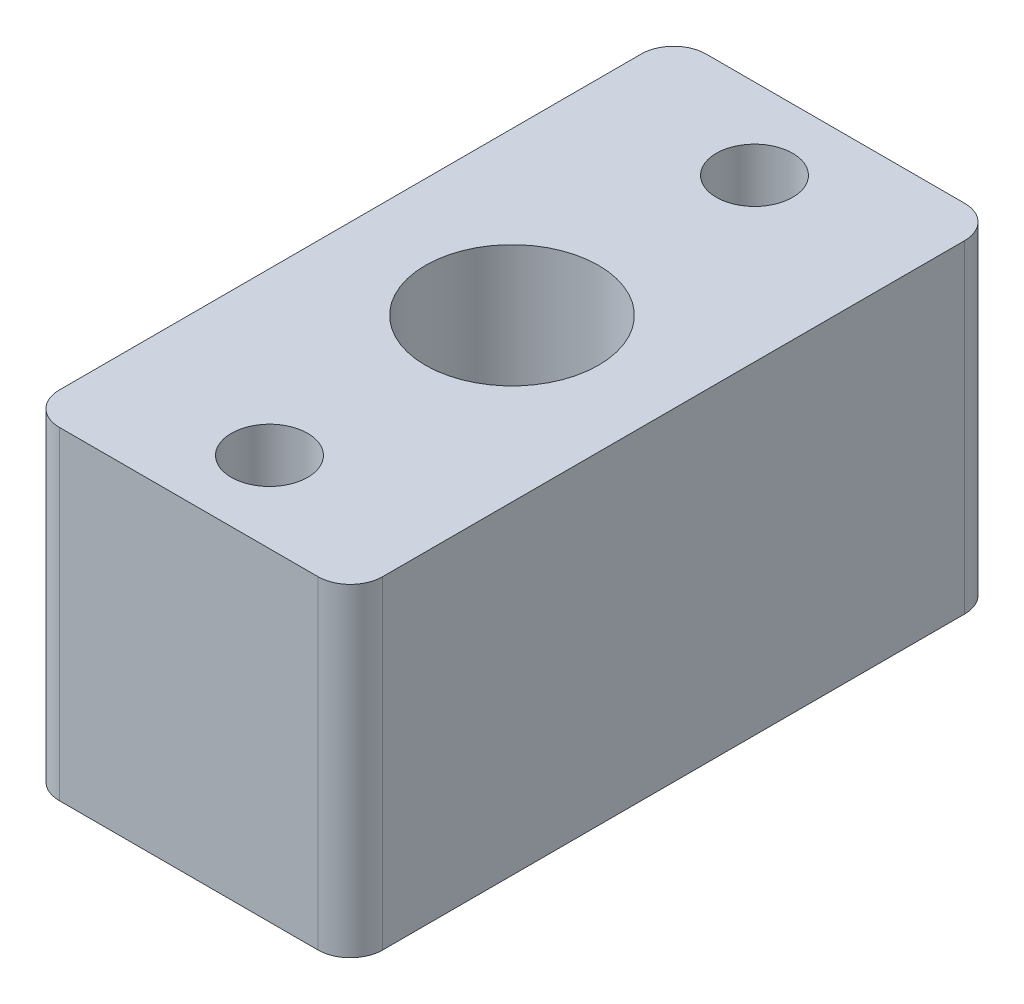
ISO-10303-21;
HEADER;
FILE_DESCRIPTION(('STEP AP214'),'2;1');
FILE_NAME('part.step','',(''),(''),'','','');
FILE_SCHEMA(('AUTOMOTIVE_DESIGN { 1 0 10303 214 1 1 1 1 }'));
ENDSEC;
DATA;
#1=APPLICATION_CONTEXT('core data for automotive mechanical design processes');
#2=APPLICATION_PROTOCOL_DEFINITION('international standard','automotive_design',2000,#1);
#3=PRODUCT_CONTEXT('',#1,'mechanical');
#4=PRODUCT('Part','Part','',(#3));
#5=PRODUCT_RELATED_PRODUCT_CATEGORY('part','',(#4));
#6=PRODUCT_DEFINITION_FORMATION('','',#4);
#7=PRODUCT_DEFINITION_CONTEXT('part definition',#1,'design');
#8=PRODUCT_DEFINITION('design','',#6,#7);
#9=PRODUCT_DEFINITION_SHAPE('','',#8);
#10=(LENGTH_UNIT() NAMED_UNIT(*) SI_UNIT(.MILLI.,.METRE.));
#11=(NAMED_UNIT(*) PLANE_ANGLE_UNIT() SI_UNIT($,.RADIAN.));
#12=(NAMED_UNIT(*) SI_UNIT($,.STERADIAN.) SOLID_ANGLE_UNIT());
#13=UNCERTAINTY_MEASURE_WITH_UNIT(LENGTH_MEASURE(1.E-05),#10,'distance_accuracy_value','');
#14=(GEOMETRIC_REPRESENTATION_CONTEXT(3) GLOBAL_UNCERTAINTY_ASSIGNED_CONTEXT((#13)) GLOBAL_UNIT_ASSIGNED_CONTEXT((#10,
#11,#12)) REPRESENTATION_CONTEXT('',''));
#15=CARTESIAN_POINT('',(0.,0.,0.));
#16=DIRECTION('',(0.,0.,1.));
#17=DIRECTION('',(1.,0.,0.));
#18=AXIS2_PLACEMENT_3D('',#15,#16,#17);
#19=CARTESIAN_POINT('',(9.95917099578882,-18011.187363794,-483.287251614497));
#20=DIRECTION('',(0.999999999042625,4.15567144702978E-05,-1.37036123745127E-05));
#21=DIRECTION('',(-4.15567144741997E-05,0.99999999913652,0.));
#22=AXIS2_PLACEMENT_3D('',#19,#20,#21);
#23=PLANE('',#22);
#24=DIRECTION('',(-1.37041015944916E-05,1.17720830808695E-05,-0.999999999836808));
#25=VECTOR('',#24,1.);
#26=CARTESIAN_POINT('',(9.95917099578882,-18011.187363794,-483.287251614497));
#27=LINE('',#26,#25);
#28=CARTESIAN_POINT('',(9.95915359157979,-18011.1873488434,-484.55725161429));
#29=VERTEX_POINT('',#28);
#30=CARTESIAN_POINT('',(9.95884031581734,-18011.1870797336,-507.417251610559));
#31=VERTEX_POINT('',#30);
#32=EDGE_CURVE('E132',#29,#31,#27,.T.);
#33=ORIENTED_EDGE('',*,*,#32,.T.);
#34=DIRECTION('',(-4.1556553143453E-05,0.999999999067229,1.17726525394311E-05));
#35=VECTOR('',#34,1.);
#36=CARTESIAN_POINT('',(9.95884031581734,-18011.1870797336,-507.417251610559));
#37=LINE('',#36,#35);
#38=CARTESIAN_POINT('',(9.95831254759242,-17998.4870797454,-507.417102097872));
#39=VERTEX_POINT('',#38);
#40=EDGE_CURVE('E11',#31,#39,#37,.T.);
#41=ORIENTED_EDGE('',*,*,#40,.T.);
#42=DIRECTION('',(-1.37041015944916E-05,1.17720830808695E-05,-0.999999999836808));
#43=VECTOR('',#42,1.);
#44=CARTESIAN_POINT('',(9.9586432275639,-17998.4873638058,-483.28710210181));
#45=LINE('',#44,#43);
#46=CARTESIAN_POINT('',(9.95862582335487,-17998.4873488553,-484.557102101603));
#47=VERTEX_POINT('',#46);
#48=EDGE_CURVE('E134',#47,#39,#45,.T.);
#49=ORIENTED_EDGE('',*,*,#48,.F.);
#50=DIRECTION('',(-4.1556553143453E-05,0.999999999067229,1.17726525394311E-05));
#51=VECTOR('',#50,1.);
#52=CARTESIAN_POINT('',(9.95915359157979,-18011.1873488434,-484.55725161429));
#53=LINE('',#52,#51);
#54=EDGE_CURVE('E45',#47,#29,#53,.F.);
#55=ORIENTED_EDGE('',*,*,#54,.T.);
#56=EDGE_LOOP('',(#33,#41,#49,#55));
#57=FACE_BOUND('',#56,.T.);
#58=ADVANCED_FACE('F37',(#57),#23,.T.);
#59=CARTESIAN_POINT('',(9.95917099578882,-18011.187363794,-483.287251614497));
#60=DIRECTION('',(-1.37041015943094E-05,1.17720830532643E-05,-0.999999999836808));
#61=DIRECTION('',(-0.999999999906099,0.,1.3704101595259E-05));
#62=AXIS2_PLACEMENT_3D('',#59,#60,#61);
#63=PLANE('',#62);
#64=DIRECTION('',(-0.999999999042625,-4.15567143251763E-05,1.37036123743333E-05));
#65=VECTOR('',#64,1.);
#66=CARTESIAN_POINT('',(9.9586432275639,-17998.4873638058,-483.28710210181));
#67=LINE('',#66,#65);
#68=CARTESIAN_POINT('',(8.68864322877976,-17998.4874165828,-483.287084698222));
#69=VERTEX_POINT('',#68);
#70=CARTESIAN_POINT('',(-1.47135676149331,-17998.4878387991,-483.286945469521));
#71=VERTEX_POINT('',#70);
#72=EDGE_CURVE('E129',#69,#71,#67,.T.);
#73=ORIENTED_EDGE('',*,*,#72,.T.);
#74=DIRECTION('',(-4.1556553143453E-05,0.999999999067229,1.17726525394311E-05));
#75=VECTOR('',#74,1.);
#76=CARTESIAN_POINT('',(-1.47082899326839,-18011.1878387872,-483.287094982208));
#77=LINE('',#76,#75);
#78=CARTESIAN_POINT('',(-1.47082899326839,-18011.1878387872,-483.287094982208));
#79=VERTEX_POINT('',#78);
#80=EDGE_CURVE('E109',#71,#79,#77,.F.);
#81=ORIENTED_EDGE('',*,*,#80,.T.);
#82=DIRECTION('',(-0.999999999042625,-4.15567143251763E-05,1.37036123743333E-05));
#83=VECTOR('',#82,1.);
#84=CARTESIAN_POINT('',(9.95917099578882,-18011.187363794,-483.287251614497));
#85=LINE('',#84,#83);
#86=CARTESIAN_POINT('',(8.68917099700469,-18011.187416571,-483.28723421091));
#87=VERTEX_POINT('',#86);
#88=EDGE_CURVE('E138',#87,#79,#85,.T.);
#89=ORIENTED_EDGE('',*,*,#88,.F.);
#90=DIRECTION('',(-4.1556553143453E-05,0.999999999067229,1.17726525394311E-05));
#91=VECTOR('',#90,1.);
#92=CARTESIAN_POINT('',(8.68864322877976,-17998.4874165828,-483.287084698222));
#93=LINE('',#92,#91);
#94=EDGE_CURVE('E114',#87,#69,#93,.T.);
#95=ORIENTED_EDGE('',*,*,#94,.T.);
#96=EDGE_LOOP('',(#73,#81,#89,#95));
#97=FACE_BOUND('',#96,.T.);
#98=ADVANCED_FACE('F174',(#97),#63,.F.);
#99=CARTESIAN_POINT('',(-2.74082899205252,-18011.1878915642,-483.28707757862));
#100=DIRECTION('',(0.999999999042625,4.15567144702978E-05,-1.37036123744102E-05));
#101=DIRECTION('',(-4.15567144741997E-05,0.99999999913652,0.));
#102=AXIS2_PLACEMENT_3D('',#99,#100,#101);
#103=PLANE('',#102);
#104=DIRECTION('',(-1.37041015943892E-05,1.17720830808695E-05,-0.999999999836808));
#105=VECTOR('',#104,1.);
#106=CARTESIAN_POINT('',(-2.74082899205252,-18011.1878915642,-483.28707757862));
#107=LINE('',#106,#105);
#108=CARTESIAN_POINT('',(-2.74084639626155,-18011.1878766137,-484.557077578413));
#109=VERTEX_POINT('',#108);
#110=CARTESIAN_POINT('',(-2.74115967202399,-18011.1876075039,-507.417077574682));
#111=VERTEX_POINT('',#110);
#112=EDGE_CURVE('E123',#109,#111,#107,.T.);
#113=ORIENTED_EDGE('',*,*,#112,.F.);
#114=DIRECTION('',(-4.1556553143453E-05,0.999999999067229,1.17726525394311E-05));
#115=VECTOR('',#114,1.);
#116=CARTESIAN_POINT('',(-2.74084639626155,-18011.1878766137,-484.557077578413));
#117=LINE('',#116,#115);
#118=CARTESIAN_POINT('',(-2.74137416448647,-17998.4878766255,-484.556928065726));
#119=VERTEX_POINT('',#118);
#120=EDGE_CURVE('E108',#109,#119,#117,.T.);
#121=ORIENTED_EDGE('',*,*,#120,.T.);
#122=DIRECTION('',(-1.37041015943892E-05,1.17720830808695E-05,-0.999999999836808));
#123=VECTOR('',#122,1.);
#124=CARTESIAN_POINT('',(-2.74135676027744,-17998.4878915761,-483.286928065933));
#125=LINE('',#124,#123);
#126=CARTESIAN_POINT('',(-2.74168744024891,-17998.4876075157,-507.416928061995));
#127=VERTEX_POINT('',#126);
#128=EDGE_CURVE('E121',#119,#127,#125,.T.);
#129=ORIENTED_EDGE('',*,*,#128,.T.);
#130=DIRECTION('',(-4.1556553143453E-05,0.999999999067229,1.17726525394311E-05));
#131=VECTOR('',#130,1.);
#132=CARTESIAN_POINT('',(-2.74115967202399,-18011.1876075039,-507.417077574682));
#133=LINE('',#132,#131);
#134=EDGE_CURVE('E125',#127,#111,#133,.F.);
#135=ORIENTED_EDGE('',*,*,#134,.T.);
#136=EDGE_LOOP('',(#113,#121,#129,#135));
#137=FACE_BOUND('',#136,.T.);
#138=ADVANCED_FACE('F120',(#137),#103,.F.);
#139=CARTESIAN_POINT('',(9.95882291160832,-18011.1870647831,-508.687251610352));
#140=DIRECTION('',(-1.37041015943094E-05,1.17720830532643E-05,-0.999999999836808));
#141=DIRECTION('',(-0.999999999906099,0.,1.3704101595259E-05));
#142=AXIS2_PLACEMENT_3D('',#139,#140,#141);
#143=PLANE('',#142);
#144=DIRECTION('',(-0.999999999042625,-4.15567143251764E-05,1.37036123743333E-05));
#145=VECTOR('',#144,1.);
#146=CARTESIAN_POINT('',(9.95882291160832,-18011.1870647831,-508.687251610352));
#147=LINE('',#146,#145);
#148=CARTESIAN_POINT('',(8.68882291282418,-18011.1871175601,-508.687234206764));
#149=VERTEX_POINT('',#148);
#150=CARTESIAN_POINT('',(-1.47117707744888,-18011.1875397763,-508.687094978063));
#151=VERTEX_POINT('',#150);
#152=EDGE_CURVE('E170',#149,#151,#147,.T.);
#153=ORIENTED_EDGE('',*,*,#152,.T.);
#154=DIRECTION('',(-4.1556553143453E-05,0.999999999067229,1.17726525394311E-05));
#155=VECTOR('',#154,1.);
#156=CARTESIAN_POINT('',(-1.47170484567381,-17998.4875397881,-508.686945465375));
#157=LINE('',#156,#155);
#158=CARTESIAN_POINT('',(-1.47170484567381,-17998.4875397881,-508.686945465375));
#159=VERTEX_POINT('',#158);
#160=EDGE_CURVE('E155',#151,#159,#157,.T.);
#161=ORIENTED_EDGE('',*,*,#160,.T.);
#162=DIRECTION('',(-0.999999999042625,-4.15567143251764E-05,1.37036123743333E-05));
#163=VECTOR('',#162,1.);
#164=CARTESIAN_POINT('',(9.9582951433834,-17998.4870647949,-508.687102097665));
#165=LINE('',#164,#163);
#166=CARTESIAN_POINT('',(8.68829514459926,-17998.4871175719,-508.687084694077));
#167=VERTEX_POINT('',#166);
#168=EDGE_CURVE('E130',#167,#159,#165,.T.);
#169=ORIENTED_EDGE('',*,*,#168,.F.);
#170=DIRECTION('',(-4.1556553143453E-05,0.999999999067229,1.17726525394311E-05));
#171=VECTOR('',#170,1.);
#172=CARTESIAN_POINT('',(8.68882291282418,-18011.1871175601,-508.687234206764));
#173=LINE('',#172,#171);
#174=EDGE_CURVE('E59',#167,#149,#173,.F.);
#175=ORIENTED_EDGE('',*,*,#174,.T.);
#176=EDGE_LOOP('',(#153,#161,#169,#175));
#177=FACE_BOUND('',#176,.T.);
#178=ADVANCED_FACE('F216',(#177),#143,.T.);
#179=CARTESIAN_POINT('',(0.748483115188057,-18011.1934336351,-0.212039522809267));
#180=DIRECTION('',(-4.15565529983312E-05,0.999999999067229,1.17726525670342E-05));
#181=DIRECTION('',(-0.999999999136527,-4.1556553001211E-05,0.));
#182=AXIS2_PLACEMENT_3D('',#179,#180,#181);
#183=PLANE('',#182);
#184=CARTESIAN_POINT('',(3.60912749134374,-18011.1875903027,-486.462164596041));
#185=DIRECTION('',(-4.15565529983312E-05,0.999999999067229,1.17726525670342E-05));
#186=DIRECTION('',(-0.999999999136527,-4.1556553001211E-05,0.));
#187=AXIS2_PLACEMENT_3D('',#184,#185,#186);
#188=CIRCLE('',#187,1.5);
#189=CARTESIAN_POINT('',(2.10912749263896,-18011.1876526376,-486.462164596041));
#190=VERTEX_POINT('',#189);
#191=EDGE_CURVE('E191',#190,#190,#188,.T.);
#192=ORIENTED_EDGE('',*,*,#191,.T.);
#193=EDGE_LOOP('',(#192));
#194=FACE_BOUND('',#193,.T.);
#195=CARTESIAN_POINT('',(3.60886642820837,-18011.1873660446,-505.512164592932));
#196=DIRECTION('',(-4.15565529983312E-05,0.999999999067229,1.17726525670342E-05));
#197=DIRECTION('',(-0.999999999136527,-4.1556553001211E-05,0.));
#198=AXIS2_PLACEMENT_3D('',#195,#196,#197);
#199=CIRCLE('',#198,1.5);
#200=CARTESIAN_POINT('',(2.10886642950358,-18011.1874283794,-505.512164592932));
#201=VERTEX_POINT('',#200);
#202=EDGE_CURVE('E185',#201,#201,#199,.T.);
#203=ORIENTED_EDGE('',*,*,#202,.T.);
#204=EDGE_LOOP('',(#203));
#205=FACE_BOUND('',#204,.T.);
#206=CARTESIAN_POINT('',(3.60899695977606,-18011.1874781737,-495.987164594487));
#207=DIRECTION('',(-4.15565529983312E-05,0.999999999067229,1.17726525670342E-05));
#208=DIRECTION('',(-0.999999999136527,-4.1556553001211E-05,0.));
#209=AXIS2_PLACEMENT_3D('',#206,#207,#208);
#210=CIRCLE('',#209,3.4);
#211=CARTESIAN_POINT('',(0.20899696271187,-18011.1876194659,-495.987164594487));
#212=VERTEX_POINT('',#211);
#213=EDGE_CURVE('E175',#212,#212,#210,.T.);
#214=ORIENTED_EDGE('',*,*,#213,.T.);
#215=EDGE_LOOP('',(#214));
#216=FACE_BOUND('',#215,.T.);
#217=ORIENTED_EDGE('',*,*,#88,.T.);
#218=CARTESIAN_POINT('',(-1.47084639747741,-18011.1878238367,-484.557094982001));
#219=DIRECTION('',(-4.15565529983312E-05,0.999999999067229,1.17726525670342E-05));
#220=DIRECTION('',(-0.999999999136527,-4.1556553001211E-05,0.));
#221=AXIS2_PLACEMENT_3D('',#218,#219,#220);
#222=CIRCLE('',#221,1.27);
#223=EDGE_CURVE('E152',#79,#109,#222,.F.);
#224=ORIENTED_EDGE('',*,*,#223,.T.);
#225=ORIENTED_EDGE('',*,*,#112,.T.);
#226=CARTESIAN_POINT('',(-1.47115967323986,-18011.1875547269,-507.41709497827));
#227=DIRECTION('',(-4.15565529983312E-05,0.999999999067229,1.17726525670342E-05));
#228=DIRECTION('',(-0.999999999136527,-4.1556553001211E-05,0.));
#229=AXIS2_PLACEMENT_3D('',#226,#227,#228);
#230=CIRCLE('',#229,1.27);
#231=EDGE_CURVE('E52',#111,#151,#230,.F.);
#232=ORIENTED_EDGE('',*,*,#231,.T.);
#233=ORIENTED_EDGE('',*,*,#152,.F.);
#234=CARTESIAN_POINT('',(8.68884031703321,-18011.1871325106,-507.417234206972));
#235=DIRECTION('',(-4.15565529983312E-05,0.999999999067229,1.17726525670342E-05));
#236=DIRECTION('',(-0.999999999136527,-4.1556553001211E-05,0.));
#237=AXIS2_PLACEMENT_3D('',#234,#235,#236);
#238=CIRCLE('',#237,1.27);
#239=EDGE_CURVE('E149',#149,#31,#238,.F.);
#240=ORIENTED_EDGE('',*,*,#239,.T.);
#241=ORIENTED_EDGE('',*,*,#32,.F.);
#242=CARTESIAN_POINT('',(8.68915359279566,-18011.1874016205,-484.557234210702));
#243=DIRECTION('',(-4.15565529983312E-05,0.999999999067229,1.17726525670342E-05));
#244=DIRECTION('',(-0.999999999136527,-4.1556553001211E-05,0.));
#245=AXIS2_PLACEMENT_3D('',#242,#243,#244);
#246=CIRCLE('',#245,1.27);
#247=EDGE_CURVE('E147',#29,#87,#246,.F.);
#248=ORIENTED_EDGE('',*,*,#247,.T.);
#249=EDGE_LOOP('',(#217,#224,#225,#232,#233,#240,#241,#248));
#250=FACE_BOUND('',#249,.T.);
#251=ADVANCED_FACE('F167',(#194,#205,#216,#250),#183,.F.);
#252=CARTESIAN_POINT('',(0.747955346963135,-17998.4934336469,-0.211890010122016));
#253=DIRECTION('',(-4.15565529983312E-05,0.999999999067229,1.17726525670342E-05));
#254=DIRECTION('',(-0.999999999136527,-4.1556553001211E-05,0.));
#255=AXIS2_PLACEMENT_3D('',#252,#253,#254);
#256=PLANE('',#255);
#257=CARTESIAN_POINT('',(3.60859972312067,-17998.4875903146,-486.462015083353));
#258=DIRECTION('',(-4.15565529983313E-05,0.999999999067229,1.17726525670342E-05));
#259=DIRECTION('',(-0.999999999136526,-4.1556553001211E-05,0.));
#260=AXIS2_PLACEMENT_3D('',#257,#258,#259);
#261=CIRCLE('',#260,1.5);
#262=CARTESIAN_POINT('',(2.10859972441588,-17998.4876526494,-486.462015083353));
#263=VERTEX_POINT('',#262);
#264=EDGE_CURVE('E194',#263,#263,#261,.T.);
#265=ORIENTED_EDGE('',*,*,#264,.F.);
#266=EDGE_LOOP('',(#265));
#267=FACE_BOUND('',#266,.T.);
#268=CARTESIAN_POINT('',(3.60833865998529,-17998.4873660564,-505.512015080244));
#269=DIRECTION('',(-4.15565529983313E-05,0.999999999067229,1.17726525670342E-05));
#270=DIRECTION('',(-0.999999999136526,-4.1556553001211E-05,0.));
#271=AXIS2_PLACEMENT_3D('',#268,#269,#270);
#272=CIRCLE('',#271,1.5);
#273=CARTESIAN_POINT('',(2.10833866128051,-17998.4874283913,-505.512015080244));
#274=VERTEX_POINT('',#273);
#275=EDGE_CURVE('E188',#274,#274,#272,.T.);
#276=ORIENTED_EDGE('',*,*,#275,.F.);
#277=EDGE_LOOP('',(#276));
#278=FACE_BOUND('',#277,.T.);
#279=CARTESIAN_POINT('',(3.60846919155298,-17998.4874781855,-495.987015081799));
#280=DIRECTION('',(-4.15565529983313E-05,0.999999999067229,1.17726525670342E-05));
#281=DIRECTION('',(-0.999999999136526,-4.1556553001211E-05,0.));
#282=AXIS2_PLACEMENT_3D('',#279,#280,#281);
#283=CIRCLE('',#282,3.39999999999998);
#284=CARTESIAN_POINT('',(0.208469194488811,-17998.4876194778,-495.987015081799));
#285=VERTEX_POINT('',#284);
#286=EDGE_CURVE('E177',#285,#285,#283,.T.);
#287=ORIENTED_EDGE('',*,*,#286,.F.);
#288=EDGE_LOOP('',(#287));
#289=FACE_BOUND('',#288,.T.);
#290=ORIENTED_EDGE('',*,*,#128,.F.);
#291=CARTESIAN_POINT('',(-1.47137416570233,-17998.4878238485,-484.556945469313));
#292=DIRECTION('',(-4.15565529983312E-05,0.999999999067229,1.17726525670342E-05));
#293=DIRECTION('',(-0.999999999136527,-4.1556553001211E-05,0.));
#294=AXIS2_PLACEMENT_3D('',#291,#292,#293);
#295=CIRCLE('',#294,1.27);
#296=EDGE_CURVE('E104',#119,#71,#295,.T.);
#297=ORIENTED_EDGE('',*,*,#296,.T.);
#298=ORIENTED_EDGE('',*,*,#72,.F.);
#299=CARTESIAN_POINT('',(8.68862582457074,-17998.4874016323,-484.557084698015));
#300=DIRECTION('',(-4.15565529983312E-05,0.999999999067229,1.17726525670342E-05));
#301=DIRECTION('',(-0.999999999136527,-4.1556553001211E-05,0.));
#302=AXIS2_PLACEMENT_3D('',#299,#300,#301);
#303=CIRCLE('',#302,1.27);
#304=EDGE_CURVE('E124',#69,#47,#303,.T.);
#305=ORIENTED_EDGE('',*,*,#304,.T.);
#306=ORIENTED_EDGE('',*,*,#48,.T.);
#307=CARTESIAN_POINT('',(8.68831254880829,-17998.4871325225,-507.417084694284));
#308=DIRECTION('',(-4.15565529983312E-05,0.999999999067229,1.17726525670342E-05));
#309=DIRECTION('',(-0.999999999136527,-4.1556553001211E-05,0.));
#310=AXIS2_PLACEMENT_3D('',#307,#308,#309);
#311=CIRCLE('',#310,1.27);
#312=EDGE_CURVE('E141',#39,#167,#311,.T.);
#313=ORIENTED_EDGE('',*,*,#312,.T.);
#314=ORIENTED_EDGE('',*,*,#168,.T.);
#315=CARTESIAN_POINT('',(-1.47168744146478,-17998.4875547387,-507.416945465583));
#316=DIRECTION('',(-4.15565529983312E-05,0.999999999067229,1.17726525670342E-05));
#317=DIRECTION('',(-0.999999999136527,-4.1556553001211E-05,0.));
#318=AXIS2_PLACEMENT_3D('',#315,#316,#317);
#319=CIRCLE('',#318,1.27);
#320=EDGE_CURVE('E115',#159,#127,#319,.T.);
#321=ORIENTED_EDGE('',*,*,#320,.T.);
#322=EDGE_LOOP('',(#290,#297,#298,#305,#306,#313,#314,#321));
#323=FACE_BOUND('',#322,.T.);
#324=ADVANCED_FACE('F127',(#267,#278,#289,#323),#256,.T.);
#325=CARTESIAN_POINT('',(-1.47084639747741,-18011.1878238367,-484.557094982001));
#326=DIRECTION('',(-4.1556553143453E-05,0.999999999067229,1.17726525394311E-05));
#327=DIRECTION('',(-0.999999999136526,-4.15565531463328E-05,0.));
#328=AXIS2_PLACEMENT_3D('',#325,#326,#327);
#329=CYLINDRICAL_SURFACE('',#328,1.27);
#330=ORIENTED_EDGE('',*,*,#223,.F.);
#331=ORIENTED_EDGE('',*,*,#80,.F.);
#332=ORIENTED_EDGE('',*,*,#296,.F.);
#333=ORIENTED_EDGE('',*,*,#120,.F.);
#334=EDGE_LOOP('',(#330,#331,#332,#333));
#335=FACE_BOUND('',#334,.T.);
#336=ADVANCED_FACE('F107',(#335),#329,.T.);
#337=CARTESIAN_POINT('',(-1.47115967323986,-18011.1875547268,-507.41709497827));
#338=DIRECTION('',(4.1556553143453E-05,-0.999999999067229,-1.17726525394311E-05));
#339=DIRECTION('',(0.999999999136526,4.15565531463328E-05,0.));
#340=AXIS2_PLACEMENT_3D('',#337,#338,#339);
#341=CYLINDRICAL_SURFACE('',#340,1.27);
#342=ORIENTED_EDGE('',*,*,#231,.F.);
#343=ORIENTED_EDGE('',*,*,#134,.F.);
#344=ORIENTED_EDGE('',*,*,#320,.F.);
#345=ORIENTED_EDGE('',*,*,#160,.F.);
#346=EDGE_LOOP('',(#342,#343,#344,#345));
#347=FACE_BOUND('',#346,.T.);
#348=ADVANCED_FACE('F234',(#347),#341,.T.);
#349=CARTESIAN_POINT('',(8.68884031703321,-18011.1871325106,-507.417234206972));
#350=DIRECTION('',(-4.1556553143453E-05,0.999999999067229,1.17726525394311E-05));
#351=DIRECTION('',(-0.999999999136526,-4.15565531463328E-05,0.));
#352=AXIS2_PLACEMENT_3D('',#349,#350,#351);
#353=CYLINDRICAL_SURFACE('',#352,1.27);
#354=ORIENTED_EDGE('',*,*,#239,.F.);
#355=ORIENTED_EDGE('',*,*,#174,.F.);
#356=ORIENTED_EDGE('',*,*,#312,.F.);
#357=ORIENTED_EDGE('',*,*,#40,.F.);
#358=EDGE_LOOP('',(#354,#355,#356,#357));
#359=FACE_BOUND('',#358,.T.);
#360=ADVANCED_FACE('F236',(#359),#353,.T.);
#361=CARTESIAN_POINT('',(8.68915359279566,-18011.1874016204,-484.557234210702));
#362=DIRECTION('',(4.1556553143453E-05,-0.999999999067229,-1.17726525394311E-05));
#363=DIRECTION('',(0.999999999136526,4.15565531463328E-05,0.));
#364=AXIS2_PLACEMENT_3D('',#361,#362,#363);
#365=CYLINDRICAL_SURFACE('',#364,1.27);
#366=ORIENTED_EDGE('',*,*,#247,.F.);
#367=ORIENTED_EDGE('',*,*,#54,.F.);
#368=ORIENTED_EDGE('',*,*,#304,.F.);
#369=ORIENTED_EDGE('',*,*,#94,.F.);
#370=EDGE_LOOP('',(#366,#367,#368,#369));
#371=FACE_BOUND('',#370,.T.);
#372=ADVANCED_FACE('F39',(#371),#365,.T.);
#373=CARTESIAN_POINT('',(3.60846919155298,-17998.4874781855,-495.987015081799));
#374=DIRECTION('',(-4.15565529983313E-05,0.999999999067229,1.17726525670342E-05));
#375=DIRECTION('',(-0.999999999136526,-4.1556553001211E-05,0.));
#376=AXIS2_PLACEMENT_3D('',#373,#374,#375);
#377=CYLINDRICAL_SURFACE('',#376,3.4);
#378=ORIENTED_EDGE('',*,*,#286,.T.);
#379=EDGE_LOOP('',(#378));
#380=FACE_BOUND('',#379,.T.);
#381=ORIENTED_EDGE('',*,*,#213,.F.);
#382=EDGE_LOOP('',(#381));
#383=FACE_BOUND('',#382,.T.);
#384=ADVANCED_FACE('F208',(#380,#383),#377,.F.);
#385=CARTESIAN_POINT('',(3.60833865998529,-17998.4873660564,-505.512015080244));
#386=DIRECTION('',(-4.15565529983313E-05,0.999999999067229,1.17726525670342E-05));
#387=DIRECTION('',(-0.999999999136526,-4.1556553001211E-05,0.));
#388=AXIS2_PLACEMENT_3D('',#385,#386,#387);
#389=CYLINDRICAL_SURFACE('',#388,1.5);
#390=ORIENTED_EDGE('',*,*,#275,.T.);
#391=EDGE_LOOP('',(#390));
#392=FACE_BOUND('',#391,.T.);
#393=ORIENTED_EDGE('',*,*,#202,.F.);
#394=EDGE_LOOP('',(#393));
#395=FACE_BOUND('',#394,.T.);
#396=ADVANCED_FACE('F211',(#392,#395),#389,.F.);
#397=CARTESIAN_POINT('',(3.60859972312067,-17998.4875903146,-486.462015083353));
#398=DIRECTION('',(-4.15565529983313E-05,0.999999999067229,1.17726525670342E-05));
#399=DIRECTION('',(-0.999999999136526,-4.1556553001211E-05,0.));
#400=AXIS2_PLACEMENT_3D('',#397,#398,#399);
#401=CYLINDRICAL_SURFACE('',#400,1.5);
#402=ORIENTED_EDGE('',*,*,#264,.T.);
#403=EDGE_LOOP('',(#402));
#404=FACE_BOUND('',#403,.T.);
#405=ORIENTED_EDGE('',*,*,#191,.F.);
#406=EDGE_LOOP('',(#405));
#407=FACE_BOUND('',#406,.T.);
#408=ADVANCED_FACE('F198',(#404,#407),#401,.F.);
#409=CLOSED_SHELL('',(#58,#98,#138,#178,#251,#324,#336,#348,#360,#372,#384,#396,#408));
#410=MANIFOLD_SOLID_BREP('B2',#409);
#411=ADVANCED_BREP_SHAPE_REPRESENTATION('',(#18,#410),#14);
#412=SHAPE_DEFINITION_REPRESENTATION(#9,#411);
ENDSEC;
END-ISO-10303-21;
